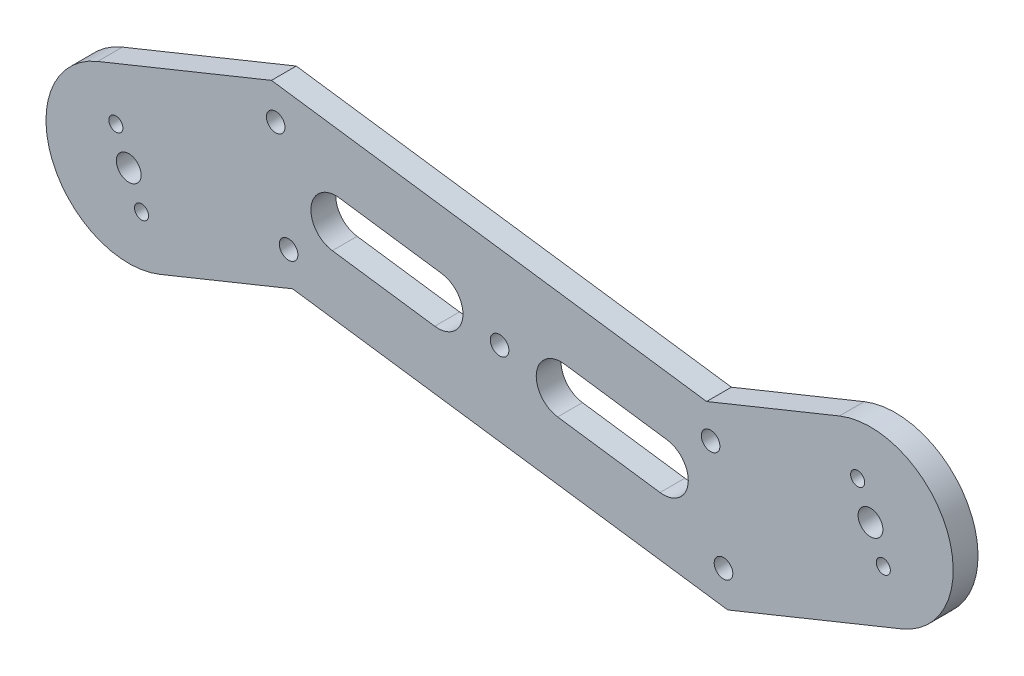
ISO-10303-21;
HEADER;
FILE_DESCRIPTION(('STEP AP214'),'2;1');
FILE_NAME('part.step','',(''),(''),'','','');
FILE_SCHEMA(('AUTOMOTIVE_DESIGN { 1 0 10303 214 1 1 1 1 }'));
ENDSEC;
DATA;
#1=APPLICATION_CONTEXT('core data for automotive mechanical design processes');
#2=APPLICATION_PROTOCOL_DEFINITION('international standard','automotive_design',2000,#1);
#3=PRODUCT_CONTEXT('',#1,'mechanical');
#4=PRODUCT('Part','Part','',(#3));
#5=PRODUCT_RELATED_PRODUCT_CATEGORY('part','',(#4));
#6=PRODUCT_DEFINITION_FORMATION('','',#4);
#7=PRODUCT_DEFINITION_CONTEXT('part definition',#1,'design');
#8=PRODUCT_DEFINITION('design','',#6,#7);
#9=PRODUCT_DEFINITION_SHAPE('','',#8);
#10=(LENGTH_UNIT() NAMED_UNIT(*) SI_UNIT(.MILLI.,.METRE.));
#11=(NAMED_UNIT(*) PLANE_ANGLE_UNIT() SI_UNIT($,.RADIAN.));
#12=(NAMED_UNIT(*) SI_UNIT($,.STERADIAN.) SOLID_ANGLE_UNIT());
#13=UNCERTAINTY_MEASURE_WITH_UNIT(LENGTH_MEASURE(1.E-05),#10,'distance_accuracy_value','');
#14=(GEOMETRIC_REPRESENTATION_CONTEXT(3) GLOBAL_UNCERTAINTY_ASSIGNED_CONTEXT((#13)) GLOBAL_UNIT_ASSIGNED_CONTEXT((#10,
#11,#12)) REPRESENTATION_CONTEXT('',''));
#15=CARTESIAN_POINT('',(0.,0.,0.));
#16=DIRECTION('',(0.,0.,1.));
#17=DIRECTION('',(1.,0.,0.));
#18=AXIS2_PLACEMENT_3D('',#15,#16,#17);
#19=CARTESIAN_POINT('',(179.33688637886,15.4363591541443,6.));
#20=DIRECTION('',(0.,0.,-1.));
#21=DIRECTION('',(-1.,0.,0.));
#22=AXIS2_PLACEMENT_3D('',#19,#20,#21);
#23=PLANE('',#22);
#24=CARTESIAN_POINT('',(182.438068149805,7.79141496706494,6.));
#25=DIRECTION('',(0.,0.,1.));
#26=DIRECTION('',(1.,0.,0.));
#27=AXIS2_PLACEMENT_3D('',#24,#25,#26);
#28=CIRCLE('',#27,1.69999999999998);
#29=CARTESIAN_POINT('',(184.138068149805,7.79141496706494,6.));
#30=VERTEX_POINT('',#29);
#31=EDGE_CURVE('E675',#30,#30,#28,.T.);
#32=ORIENTED_EDGE('',*,*,#31,.F.);
#33=EDGE_LOOP('',(#32));
#34=FACE_BOUND('',#33,.T.);
#35=CARTESIAN_POINT('',(176.235704607915,23.0813033412238,6.));
#36=DIRECTION('',(0.,0.,1.));
#37=DIRECTION('',(1.,0.,0.));
#38=AXIS2_PLACEMENT_3D('',#35,#36,#37);
#39=CIRCLE('',#38,1.69999999999998);
#40=CARTESIAN_POINT('',(177.935704607915,23.0813033412238,6.));
#41=VERTEX_POINT('',#40);
#42=EDGE_CURVE('E677',#41,#41,#39,.T.);
#43=ORIENTED_EDGE('',*,*,#42,.F.);
#44=EDGE_LOOP('',(#43));
#45=FACE_BOUND('',#44,.T.);
#46=CARTESIAN_POINT('',(-3.10118177094482,7.64494418707943,6.));
#47=DIRECTION('',(0.,0.,1.));
#48=DIRECTION('',(1.,0.,0.));
#49=AXIS2_PLACEMENT_3D('',#46,#47,#48);
#50=CIRCLE('',#49,1.69999999999999);
#51=CARTESIAN_POINT('',(-1.40118177094483,7.64494418707943,6.));
#52=VERTEX_POINT('',#51);
#53=EDGE_CURVE('E685',#52,#52,#50,.T.);
#54=ORIENTED_EDGE('',*,*,#53,.F.);
#55=EDGE_LOOP('',(#54));
#56=FACE_BOUND('',#55,.T.);
#57=CARTESIAN_POINT('',(3.10118177094482,-7.64494418707943,6.));
#58=DIRECTION('',(0.,0.,1.));
#59=DIRECTION('',(1.,0.,0.));
#60=AXIS2_PLACEMENT_3D('',#57,#58,#59);
#61=CIRCLE('',#60,1.69999999999999);
#62=CARTESIAN_POINT('',(4.80118177094481,-7.64494418707943,6.));
#63=VERTEX_POINT('',#62);
#64=EDGE_CURVE('E690',#63,#63,#61,.T.);
#65=ORIENTED_EDGE('',*,*,#64,.F.);
#66=EDGE_LOOP('',(#65));
#67=FACE_BOUND('',#66,.T.);
#68=DIRECTION('',(-0.990461425696652,0.137790290684634,0.));
#69=VECTOR('',#68,1.);
#70=CARTESIAN_POINT('',(75.6382635480882,15.7278024915215,6.));
#71=LINE('',#70,#69);
#72=CARTESIAN_POINT('',(75.6382635480882,15.7278024915215,6.));
#73=VERTEX_POINT('',#72);
#74=CARTESIAN_POINT('',(50.8767279056719,19.1725597586373,6.));
#75=VERTEX_POINT('',#74);
#76=EDGE_CURVE('E181',#73,#75,#71,.T.);
#77=ORIENTED_EDGE('',*,*,#76,.F.);
#78=CARTESIAN_POINT('',(74.8115218039804,9.78503393734157,6.));
#79=DIRECTION('',(0.,0.,1.));
#80=DIRECTION('',(1.,0.,0.));
#81=AXIS2_PLACEMENT_3D('',#78,#79,#80);
#82=CIRCLE('',#81,6.);
#83=CARTESIAN_POINT('',(73.9847800598726,3.84226538316166,6.));
#84=VERTEX_POINT('',#83);
#85=EDGE_CURVE('E53',#84,#73,#82,.T.);
#86=ORIENTED_EDGE('',*,*,#85,.F.);
#87=DIRECTION('',(0.990461425696652,-0.137790290684634,0.));
#88=VECTOR('',#87,1.);
#89=CARTESIAN_POINT('',(73.9847800598726,3.84226538316166,6.));
#90=LINE('',#89,#88);
#91=CARTESIAN_POINT('',(49.2232444174563,7.28702265027752,6.));
#92=VERTEX_POINT('',#91);
#93=EDGE_CURVE('E169',#92,#84,#90,.T.);
#94=ORIENTED_EDGE('',*,*,#93,.F.);
#95=CARTESIAN_POINT('',(50.0499861615641,13.2297912044574,6.));
#96=DIRECTION('',(0.,0.,1.));
#97=DIRECTION('',(1.,0.,0.));
#98=AXIS2_PLACEMENT_3D('',#95,#96,#97);
#99=CIRCLE('',#98,6.);
#100=EDGE_CURVE('E172',#75,#92,#99,.T.);
#101=ORIENTED_EDGE('',*,*,#100,.F.);
#102=EDGE_LOOP('',(#77,#86,#94,#101));
#103=FACE_BOUND('',#102,.T.);
#104=DIRECTION('',(-0.990461425696652,0.137790290684634,0.));
#105=VECTOR('',#104,1.);
#106=CARTESIAN_POINT('',(130.113641961404,8.14933650386659,6.));
#107=LINE('',#106,#105);
#108=CARTESIAN_POINT('',(130.113641961404,8.14933650386659,6.));
#109=VERTEX_POINT('',#108);
#110=CARTESIAN_POINT('',(105.352106318988,11.5940937709824,6.));
#111=VERTEX_POINT('',#110);
#112=EDGE_CURVE('E207',#109,#111,#107,.T.);
#113=ORIENTED_EDGE('',*,*,#112,.F.);
#114=CARTESIAN_POINT('',(129.286900217296,2.20656794968668,6.));
#115=DIRECTION('',(0.,0.,1.));
#116=DIRECTION('',(1.,0.,0.));
#117=AXIS2_PLACEMENT_3D('',#114,#115,#116);
#118=CIRCLE('',#117,6.);
#119=CARTESIAN_POINT('',(128.460158473188,-3.73620060449323,6.));
#120=VERTEX_POINT('',#119);
#121=EDGE_CURVE('E188',#120,#109,#118,.T.);
#122=ORIENTED_EDGE('',*,*,#121,.F.);
#123=DIRECTION('',(0.990461425696652,-0.137790290684634,0.));
#124=VECTOR('',#123,1.);
#125=CARTESIAN_POINT('',(128.460158473188,-3.73620060449323,6.));
#126=LINE('',#125,#124);
#127=CARTESIAN_POINT('',(103.698622830772,-0.291443337377381,6.));
#128=VERTEX_POINT('',#127);
#129=EDGE_CURVE('E196',#128,#120,#126,.T.);
#130=ORIENTED_EDGE('',*,*,#129,.F.);
#131=CARTESIAN_POINT('',(104.52536457488,5.65132521680253,6.));
#132=DIRECTION('',(0.,0.,1.));
#133=DIRECTION('',(1.,0.,0.));
#134=AXIS2_PLACEMENT_3D('',#131,#132,#133);
#135=CIRCLE('',#134,6.);
#136=EDGE_CURVE('E210',#111,#128,#135,.T.);
#137=ORIENTED_EDGE('',*,*,#136,.F.);
#138=EDGE_LOOP('',(#113,#122,#130,#137));
#139=FACE_BOUND('',#138,.T.);
#140=CARTESIAN_POINT('',(35.5351594769874,27.3646195025487,6.));
#141=DIRECTION('',(0.,0.,1.));
#142=DIRECTION('',(1.,0.,0.));
#143=AXIS2_PLACEMENT_3D('',#140,#141,#142);
#144=CIRCLE('',#143,2.24999999999999);
#145=CARTESIAN_POINT('',(37.7851594769874,27.3646195025487,6.));
#146=VERTEX_POINT('',#145);
#147=EDGE_CURVE('E217',#146,#146,#144,.T.);
#148=ORIENTED_EDGE('',*,*,#147,.F.);
#149=EDGE_LOOP('',(#148));
#150=FACE_BOUND('',#149,.T.);
#151=CARTESIAN_POINT('',(143.801726901873,-11.9282603484047,6.));
#152=DIRECTION('',(0.,0.,1.));
#153=DIRECTION('',(1.,0.,0.));
#154=AXIS2_PLACEMENT_3D('',#151,#152,#153);
#155=CIRCLE('',#154,2.25);
#156=CARTESIAN_POINT('',(146.051726901873,-11.9282603484047,6.));
#157=VERTEX_POINT('',#156);
#158=EDGE_CURVE('E226',#157,#157,#155,.T.);
#159=ORIENTED_EDGE('',*,*,#158,.F.);
#160=EDGE_LOOP('',(#159));
#161=FACE_BOUND('',#160,.T.);
#162=CARTESIAN_POINT('',(38.6541562298591,2.25235255083962,6.));
#163=DIRECTION('',(0.,0.,1.));
#164=DIRECTION('',(1.,0.,0.));
#165=AXIS2_PLACEMENT_3D('',#162,#163,#164);
#166=CIRCLE('',#165,2.24999999999999);
#167=CARTESIAN_POINT('',(40.9041562298591,2.25235255083962,6.));
#168=VERTEX_POINT('',#167);
#169=EDGE_CURVE('E230',#168,#168,#166,.T.);
#170=ORIENTED_EDGE('',*,*,#169,.F.);
#171=EDGE_LOOP('',(#170));
#172=FACE_BOUND('',#171,.T.);
#173=CARTESIAN_POINT('',(140.682730149001,13.1840066033045,6.));
#174=DIRECTION('',(0.,0.,1.));
#175=DIRECTION('',(1.,0.,0.));
#176=AXIS2_PLACEMENT_3D('',#173,#174,#175);
#177=CIRCLE('',#176,2.25);
#178=CARTESIAN_POINT('',(142.932730149001,13.1840066033045,6.));
#179=VERTEX_POINT('',#178);
#180=EDGE_CURVE('E234',#179,#179,#177,.T.);
#181=ORIENTED_EDGE('',*,*,#180,.F.);
#182=EDGE_LOOP('',(#181));
#183=FACE_BOUND('',#182,.T.);
#184=CARTESIAN_POINT('',(89.6684431894302,7.71817957707206,6.));
#185=DIRECTION('',(0.,0.,1.));
#186=DIRECTION('',(1.,0.,0.));
#187=AXIS2_PLACEMENT_3D('',#184,#185,#186);
#188=CIRCLE('',#187,2.24999999999999);
#189=CARTESIAN_POINT('',(91.9184431894302,7.71817957707206,6.));
#190=VERTEX_POINT('',#189);
#191=EDGE_CURVE('E238',#190,#190,#188,.T.);
#192=ORIENTED_EDGE('',*,*,#191,.F.);
#193=EDGE_LOOP('',(#192));
#194=FACE_BOUND('',#193,.T.);
#195=CARTESIAN_POINT('',(179.33688637886,15.4363591541443,6.));
#196=DIRECTION('',(0.,0.,1.));
#197=DIRECTION('',(1.,0.,0.));
#198=AXIS2_PLACEMENT_3D('',#195,#196,#197);
#199=CIRCLE('',#198,2.99999999999999);
#200=CARTESIAN_POINT('',(182.33688637886,15.4363591541443,6.));
#201=VERTEX_POINT('',#200);
#202=EDGE_CURVE('E250',#201,#201,#199,.T.);
#203=ORIENTED_EDGE('',*,*,#202,.F.);
#204=EDGE_LOOP('',(#203));
#205=FACE_BOUND('',#204,.T.);
#206=CARTESIAN_POINT('',(179.33688637886,15.4363591541443,6.));
#207=DIRECTION('',(0.,0.,1.));
#208=DIRECTION('',(-1.,0.,0.));
#209=AXIS2_PLACEMENT_3D('',#206,#207,#208);
#210=CIRCLE('',#209,20.);
#211=CARTESIAN_POINT('',(186.854902793272,-3.09683887513906,6.));
#212=VERTEX_POINT('',#211);
#213=CARTESIAN_POINT('',(171.818869964449,33.9695571834278,6.));
#214=VERTEX_POINT('',#213);
#215=EDGE_CURVE('E256',#212,#214,#210,.T.);
#216=ORIENTED_EDGE('',*,*,#215,.T.);
#217=DIRECTION('',(-0.926659901464171,-0.37590082072059,0.));
#218=VECTOR('',#217,1.);
#219=CARTESIAN_POINT('',(139.718429350994,20.9479707815297,6.));
#220=LINE('',#219,#218);
#221=CARTESIAN_POINT('',(139.718429350994,20.9479707815297,6.));
#222=VERTEX_POINT('',#221);
#223=EDGE_CURVE('E259',#214,#222,#220,.T.);
#224=ORIENTED_EDGE('',*,*,#223,.T.);
#225=DIRECTION('',(-0.990461425696652,0.137790290684634,0.));
#226=VECTOR('',#225,1.);
#227=CARTESIAN_POINT('',(34.5143350892678,35.5836772850323,6.));
#228=LINE('',#227,#226);
#229=CARTESIAN_POINT('',(34.5143350892678,35.5836772850323,6.));
#230=VERTEX_POINT('',#229);
#231=EDGE_CURVE('E262',#222,#230,#228,.T.);
#232=ORIENTED_EDGE('',*,*,#231,.T.);
#233=DIRECTION('',(-0.926659901464173,-0.375900820720584,0.));
#234=VECTOR('',#233,1.);
#235=CARTESIAN_POINT('',(34.5143350892678,35.5836772850323,6.));
#236=LINE('',#235,#234);
#237=CARTESIAN_POINT('',(-7.51801641441168,18.5331980292835,6.));
#238=VERTEX_POINT('',#237);
#239=EDGE_CURVE('E264',#230,#238,#236,.T.);
#240=ORIENTED_EDGE('',*,*,#239,.T.);
#241=CARTESIAN_POINT('',(0.,0.,6.));
#242=DIRECTION('',(0.,0.,1.));
#243=DIRECTION('',(1.,0.,0.));
#244=AXIS2_PLACEMENT_3D('',#241,#242,#243);
#245=CIRCLE('',#244,20.);
#246=CARTESIAN_POINT('',(7.51801641441168,-18.5331980292835,6.));
#247=VERTEX_POINT('',#246);
#248=EDGE_CURVE('E266',#238,#247,#245,.T.);
#249=ORIENTED_EDGE('',*,*,#248,.T.);
#250=DIRECTION('',(0.926659901464173,0.375900820720584,0.));
#251=VECTOR('',#250,1.);
#252=CARTESIAN_POINT('',(39.6184570278661,-5.51161162738561,6.));
#253=LINE('',#252,#251);
#254=CARTESIAN_POINT('',(39.6184570278661,-5.51161162738561,6.));
#255=VERTEX_POINT('',#254);
#256=EDGE_CURVE('E268',#247,#255,#253,.T.);
#257=ORIENTED_EDGE('',*,*,#256,.T.);
#258=DIRECTION('',(0.990461425696652,-0.137790290684634,0.));
#259=VECTOR('',#258,1.);
#260=CARTESIAN_POINT('',(39.6184570278661,-5.51161162738561,6.));
#261=LINE('',#260,#259);
#262=CARTESIAN_POINT('',(144.822551289593,-20.1473181308882,6.));
#263=VERTEX_POINT('',#262);
#264=EDGE_CURVE('E270',#255,#263,#261,.T.);
#265=ORIENTED_EDGE('',*,*,#264,.T.);
#266=DIRECTION('',(0.92665990146417,0.375900820720591,0.));
#267=VECTOR('',#266,1.);
#268=CARTESIAN_POINT('',(144.822551289593,-20.1473181308882,6.));
#269=LINE('',#268,#267);
#270=EDGE_CURVE('E273',#263,#212,#269,.T.);
#271=ORIENTED_EDGE('',*,*,#270,.T.);
#272=EDGE_LOOP('',(#216,#224,#232,#240,#249,#257,#265,#271));
#273=FACE_BOUND('',#272,.T.);
#274=CARTESIAN_POINT('',(0.,0.,6.));
#275=DIRECTION('',(0.,0.,1.));
#276=DIRECTION('',(1.,0.,0.));
#277=AXIS2_PLACEMENT_3D('',#274,#275,#276);
#278=CIRCLE('',#277,3.00000000000001);
#279=CARTESIAN_POINT('',(3.00000000000001,0.,6.));
#280=VERTEX_POINT('',#279);
#281=EDGE_CURVE('E243',#280,#280,#278,.T.);
#282=ORIENTED_EDGE('',*,*,#281,.F.);
#283=EDGE_LOOP('',(#282));
#284=FACE_BOUND('',#283,.T.);
#285=ADVANCED_FACE('F36',(#34,#45,#56,#67,#103,#139,#150,#161,#172,#183,#194,#205,#273,#284),
#23,.F.);
#286=CARTESIAN_POINT('',(179.33688637886,15.4363591541443,0.));
#287=DIRECTION('',(0.,0.,-1.));
#288=DIRECTION('',(-1.,0.,0.));
#289=AXIS2_PLACEMENT_3D('',#286,#287,#288);
#290=PLANE('',#289);
#291=CARTESIAN_POINT('',(182.438068149805,7.79141496706494,0.));
#292=DIRECTION('',(0.,0.,1.));
#293=DIRECTION('',(1.,0.,0.));
#294=AXIS2_PLACEMENT_3D('',#291,#292,#293);
#295=CIRCLE('',#294,1.69999999999998);
#296=CARTESIAN_POINT('',(184.138068149805,7.79141496706494,0.));
#297=VERTEX_POINT('',#296);
#298=EDGE_CURVE('E673',#297,#297,#295,.T.);
#299=ORIENTED_EDGE('',*,*,#298,.T.);
#300=EDGE_LOOP('',(#299));
#301=FACE_BOUND('',#300,.T.);
#302=CARTESIAN_POINT('',(176.235704607915,23.0813033412238,0.));
#303=DIRECTION('',(0.,0.,1.));
#304=DIRECTION('',(1.,0.,0.));
#305=AXIS2_PLACEMENT_3D('',#302,#303,#304);
#306=CIRCLE('',#305,1.69999999999998);
#307=CARTESIAN_POINT('',(177.935704607915,23.0813033412238,0.));
#308=VERTEX_POINT('',#307);
#309=EDGE_CURVE('E682',#308,#308,#306,.T.);
#310=ORIENTED_EDGE('',*,*,#309,.T.);
#311=EDGE_LOOP('',(#310));
#312=FACE_BOUND('',#311,.T.);
#313=CARTESIAN_POINT('',(-3.10118177094482,7.64494418707943,0.));
#314=DIRECTION('',(0.,0.,1.));
#315=DIRECTION('',(1.,0.,0.));
#316=AXIS2_PLACEMENT_3D('',#313,#314,#315);
#317=CIRCLE('',#316,1.69999999999999);
#318=CARTESIAN_POINT('',(-1.40118177094483,7.64494418707943,0.));
#319=VERTEX_POINT('',#318);
#320=EDGE_CURVE('E688',#319,#319,#317,.T.);
#321=ORIENTED_EDGE('',*,*,#320,.T.);
#322=EDGE_LOOP('',(#321));
#323=FACE_BOUND('',#322,.T.);
#324=CARTESIAN_POINT('',(3.10118177094482,-7.64494418707943,0.));
#325=DIRECTION('',(0.,0.,1.));
#326=DIRECTION('',(1.,0.,0.));
#327=AXIS2_PLACEMENT_3D('',#324,#325,#326);
#328=CIRCLE('',#327,1.69999999999999);
#329=CARTESIAN_POINT('',(4.80118177094481,-7.64494418707943,0.));
#330=VERTEX_POINT('',#329);
#331=EDGE_CURVE('E175',#330,#330,#328,.T.);
#332=ORIENTED_EDGE('',*,*,#331,.T.);
#333=EDGE_LOOP('',(#332));
#334=FACE_BOUND('',#333,.T.);
#335=CARTESIAN_POINT('',(74.8115218039804,9.78503393734157,0.));
#336=DIRECTION('',(0.,0.,1.));
#337=DIRECTION('',(1.,0.,0.));
#338=AXIS2_PLACEMENT_3D('',#335,#336,#337);
#339=CIRCLE('',#338,6.);
#340=CARTESIAN_POINT('',(73.9847800598726,3.84226538316166,0.));
#341=VERTEX_POINT('',#340);
#342=CARTESIAN_POINT('',(75.6382635480882,15.7278024915215,0.));
#343=VERTEX_POINT('',#342);
#344=EDGE_CURVE('E153',#341,#343,#339,.T.);
#345=ORIENTED_EDGE('',*,*,#344,.T.);
#346=DIRECTION('',(-0.990461425696652,0.137790290684634,0.));
#347=VECTOR('',#346,1.);
#348=CARTESIAN_POINT('',(75.6382635480882,15.7278024915215,0.));
#349=LINE('',#348,#347);
#350=CARTESIAN_POINT('',(50.8767279056719,19.1725597586373,0.));
#351=VERTEX_POINT('',#350);
#352=EDGE_CURVE('E162',#343,#351,#349,.T.);
#353=ORIENTED_EDGE('',*,*,#352,.T.);
#354=CARTESIAN_POINT('',(50.0499861615641,13.2297912044574,0.));
#355=DIRECTION('',(0.,0.,1.));
#356=DIRECTION('',(1.,0.,0.));
#357=AXIS2_PLACEMENT_3D('',#354,#355,#356);
#358=CIRCLE('',#357,6.);
#359=CARTESIAN_POINT('',(49.2232444174563,7.28702265027752,0.));
#360=VERTEX_POINT('',#359);
#361=EDGE_CURVE('E61',#351,#360,#358,.T.);
#362=ORIENTED_EDGE('',*,*,#361,.T.);
#363=DIRECTION('',(0.990461425696652,-0.137790290684634,0.));
#364=VECTOR('',#363,1.);
#365=CARTESIAN_POINT('',(73.9847800598726,3.84226538316166,0.));
#366=LINE('',#365,#364);
#367=EDGE_CURVE('E159',#360,#341,#366,.T.);
#368=ORIENTED_EDGE('',*,*,#367,.T.);
#369=EDGE_LOOP('',(#345,#353,#362,#368));
#370=FACE_BOUND('',#369,.T.);
#371=CARTESIAN_POINT('',(129.286900217296,2.20656794968668,0.));
#372=DIRECTION('',(0.,0.,1.));
#373=DIRECTION('',(1.,0.,0.));
#374=AXIS2_PLACEMENT_3D('',#371,#372,#373);
#375=CIRCLE('',#374,6.);
#376=CARTESIAN_POINT('',(128.460158473188,-3.73620060449323,0.));
#377=VERTEX_POINT('',#376);
#378=CARTESIAN_POINT('',(130.113641961404,8.14933650386659,0.));
#379=VERTEX_POINT('',#378);
#380=EDGE_CURVE('E192',#377,#379,#375,.T.);
#381=ORIENTED_EDGE('',*,*,#380,.T.);
#382=DIRECTION('',(-0.990461425696652,0.137790290684634,0.));
#383=VECTOR('',#382,1.);
#384=CARTESIAN_POINT('',(130.113641961404,8.14933650386659,0.));
#385=LINE('',#384,#383);
#386=CARTESIAN_POINT('',(105.352106318988,11.5940937709824,0.));
#387=VERTEX_POINT('',#386);
#388=EDGE_CURVE('E195',#379,#387,#385,.T.);
#389=ORIENTED_EDGE('',*,*,#388,.T.);
#390=CARTESIAN_POINT('',(104.52536457488,5.65132521680253,0.));
#391=DIRECTION('',(0.,0.,1.));
#392=DIRECTION('',(1.,0.,0.));
#393=AXIS2_PLACEMENT_3D('',#390,#391,#392);
#394=CIRCLE('',#393,6.);
#395=CARTESIAN_POINT('',(103.698622830772,-0.291443337377381,0.));
#396=VERTEX_POINT('',#395);
#397=EDGE_CURVE('E199',#387,#396,#394,.T.);
#398=ORIENTED_EDGE('',*,*,#397,.T.);
#399=DIRECTION('',(0.990461425696652,-0.137790290684634,0.));
#400=VECTOR('',#399,1.);
#401=CARTESIAN_POINT('',(128.460158473188,-3.73620060449323,0.));
#402=LINE('',#401,#400);
#403=EDGE_CURVE('E202',#396,#377,#402,.T.);
#404=ORIENTED_EDGE('',*,*,#403,.T.);
#405=EDGE_LOOP('',(#381,#389,#398,#404));
#406=FACE_BOUND('',#405,.T.);
#407=CARTESIAN_POINT('',(35.5351594769874,27.3646195025487,0.));
#408=DIRECTION('',(0.,0.,-1.));
#409=DIRECTION('',(-1.,0.,0.));
#410=AXIS2_PLACEMENT_3D('',#407,#408,#409);
#411=CIRCLE('',#410,2.24999999999999);
#412=CARTESIAN_POINT('',(33.2851594769874,27.3646195025487,0.));
#413=VERTEX_POINT('',#412);
#414=EDGE_CURVE('E40',#413,#413,#411,.T.);
#415=ORIENTED_EDGE('',*,*,#414,.F.);
#416=EDGE_LOOP('',(#415));
#417=FACE_BOUND('',#416,.T.);
#418=CARTESIAN_POINT('',(143.801726901873,-11.9282603484047,0.));
#419=DIRECTION('',(0.,0.,-1.));
#420=DIRECTION('',(-1.,0.,0.));
#421=AXIS2_PLACEMENT_3D('',#418,#419,#420);
#422=CIRCLE('',#421,2.25);
#423=CARTESIAN_POINT('',(141.551726901873,-11.9282603484047,0.));
#424=VERTEX_POINT('',#423);
#425=EDGE_CURVE('E229',#424,#424,#422,.T.);
#426=ORIENTED_EDGE('',*,*,#425,.F.);
#427=EDGE_LOOP('',(#426));
#428=FACE_BOUND('',#427,.T.);
#429=CARTESIAN_POINT('',(38.6541562298591,2.25235255083962,0.));
#430=DIRECTION('',(0.,0.,-1.));
#431=DIRECTION('',(-1.,0.,0.));
#432=AXIS2_PLACEMENT_3D('',#429,#430,#431);
#433=CIRCLE('',#432,2.24999999999999);
#434=CARTESIAN_POINT('',(36.4041562298591,2.25235255083962,0.));
#435=VERTEX_POINT('',#434);
#436=EDGE_CURVE('E233',#435,#435,#433,.T.);
#437=ORIENTED_EDGE('',*,*,#436,.F.);
#438=EDGE_LOOP('',(#437));
#439=FACE_BOUND('',#438,.T.);
#440=CARTESIAN_POINT('',(140.682730149001,13.1840066033045,0.));
#441=DIRECTION('',(0.,0.,-1.));
#442=DIRECTION('',(-1.,0.,0.));
#443=AXIS2_PLACEMENT_3D('',#440,#441,#442);
#444=CIRCLE('',#443,2.25);
#445=CARTESIAN_POINT('',(138.432730149001,13.1840066033045,0.));
#446=VERTEX_POINT('',#445);
#447=EDGE_CURVE('E237',#446,#446,#444,.T.);
#448=ORIENTED_EDGE('',*,*,#447,.F.);
#449=EDGE_LOOP('',(#448));
#450=FACE_BOUND('',#449,.T.);
#451=CARTESIAN_POINT('',(89.6684431894302,7.71817957707206,0.));
#452=DIRECTION('',(0.,0.,-1.));
#453=DIRECTION('',(-1.,0.,0.));
#454=AXIS2_PLACEMENT_3D('',#451,#452,#453);
#455=CIRCLE('',#454,2.24999999999999);
#456=CARTESIAN_POINT('',(87.4184431894302,7.71817957707206,0.));
#457=VERTEX_POINT('',#456);
#458=EDGE_CURVE('E242',#457,#457,#455,.T.);
#459=ORIENTED_EDGE('',*,*,#458,.F.);
#460=EDGE_LOOP('',(#459));
#461=FACE_BOUND('',#460,.T.);
#462=CARTESIAN_POINT('',(179.33688637886,15.4363591541443,0.));
#463=DIRECTION('',(0.,0.,1.));
#464=DIRECTION('',(1.,0.,0.));
#465=AXIS2_PLACEMENT_3D('',#462,#463,#464);
#466=CIRCLE('',#465,2.99999999999999);
#467=CARTESIAN_POINT('',(182.33688637886,15.4363591541443,0.));
#468=VERTEX_POINT('',#467);
#469=EDGE_CURVE('E246',#468,#468,#466,.T.);
#470=ORIENTED_EDGE('',*,*,#469,.T.);
#471=EDGE_LOOP('',(#470));
#472=FACE_BOUND('',#471,.T.);
#473=CARTESIAN_POINT('',(179.33688637886,15.4363591541443,0.));
#474=DIRECTION('',(0.,0.,1.));
#475=DIRECTION('',(-1.,0.,0.));
#476=AXIS2_PLACEMENT_3D('',#473,#474,#475);
#477=CIRCLE('',#476,20.);
#478=CARTESIAN_POINT('',(186.854902793272,-3.09683887513906,0.));
#479=VERTEX_POINT('',#478);
#480=CARTESIAN_POINT('',(171.818869964449,33.9695571834278,0.));
#481=VERTEX_POINT('',#480);
#482=EDGE_CURVE('E253',#479,#481,#477,.T.);
#483=ORIENTED_EDGE('',*,*,#482,.F.);
#484=DIRECTION('',(0.92665990146417,0.375900820720591,0.));
#485=VECTOR('',#484,1.);
#486=CARTESIAN_POINT('',(144.822551289593,-20.1473181308882,0.));
#487=LINE('',#486,#485);
#488=CARTESIAN_POINT('',(144.822551289593,-20.1473181308882,0.));
#489=VERTEX_POINT('',#488);
#490=EDGE_CURVE('E260',#489,#479,#487,.T.);
#491=ORIENTED_EDGE('',*,*,#490,.F.);
#492=DIRECTION('',(0.990461425696652,-0.137790290684634,0.));
#493=VECTOR('',#492,1.);
#494=CARTESIAN_POINT('',(39.6184570278661,-5.51161162738561,0.));
#495=LINE('',#494,#493);
#496=CARTESIAN_POINT('',(39.6184570278661,-5.51161162738561,0.));
#497=VERTEX_POINT('',#496);
#498=EDGE_CURVE('E289',#497,#489,#495,.T.);
#499=ORIENTED_EDGE('',*,*,#498,.F.);
#500=DIRECTION('',(0.926659901464173,0.375900820720584,0.));
#501=VECTOR('',#500,1.);
#502=CARTESIAN_POINT('',(39.6184570278661,-5.51161162738561,0.));
#503=LINE('',#502,#501);
#504=CARTESIAN_POINT('',(7.51801641441168,-18.5331980292835,0.));
#505=VERTEX_POINT('',#504);
#506=EDGE_CURVE('E287',#505,#497,#503,.T.);
#507=ORIENTED_EDGE('',*,*,#506,.F.);
#508=CARTESIAN_POINT('',(0.,0.,0.));
#509=DIRECTION('',(0.,0.,1.));
#510=DIRECTION('',(1.,0.,0.));
#511=AXIS2_PLACEMENT_3D('',#508,#509,#510);
#512=CIRCLE('',#511,20.);
#513=CARTESIAN_POINT('',(-7.51801641441168,18.5331980292835,0.));
#514=VERTEX_POINT('',#513);
#515=EDGE_CURVE('E285',#514,#505,#512,.T.);
#516=ORIENTED_EDGE('',*,*,#515,.F.);
#517=DIRECTION('',(-0.926659901464173,-0.375900820720584,0.));
#518=VECTOR('',#517,1.);
#519=CARTESIAN_POINT('',(34.5143350892678,35.5836772850323,0.));
#520=LINE('',#519,#518);
#521=CARTESIAN_POINT('',(34.5143350892678,35.5836772850323,0.));
#522=VERTEX_POINT('',#521);
#523=EDGE_CURVE('E283',#522,#514,#520,.T.);
#524=ORIENTED_EDGE('',*,*,#523,.F.);
#525=DIRECTION('',(-0.990461425696652,0.137790290684634,0.));
#526=VECTOR('',#525,1.);
#527=CARTESIAN_POINT('',(34.5143350892678,35.5836772850323,0.));
#528=LINE('',#527,#526);
#529=CARTESIAN_POINT('',(139.718429350994,20.9479707815297,0.));
#530=VERTEX_POINT('',#529);
#531=EDGE_CURVE('E280',#530,#522,#528,.T.);
#532=ORIENTED_EDGE('',*,*,#531,.F.);
#533=DIRECTION('',(-0.926659901464171,-0.37590082072059,0.));
#534=VECTOR('',#533,1.);
#535=CARTESIAN_POINT('',(139.718429350994,20.9479707815297,0.));
#536=LINE('',#535,#534);
#537=EDGE_CURVE('E278',#481,#530,#536,.T.);
#538=ORIENTED_EDGE('',*,*,#537,.F.);
#539=EDGE_LOOP('',(#483,#491,#499,#507,#516,#524,#532,#538));
#540=FACE_BOUND('',#539,.T.);
#541=CARTESIAN_POINT('',(0.,0.,0.));
#542=DIRECTION('',(0.,0.,1.));
#543=DIRECTION('',(1.,0.,0.));
#544=AXIS2_PLACEMENT_3D('',#541,#542,#543);
#545=CIRCLE('',#544,3.00000000000001);
#546=CARTESIAN_POINT('',(3.00000000000001,0.,0.));
#547=VERTEX_POINT('',#546);
#548=EDGE_CURVE('E247',#547,#547,#545,.T.);
#549=ORIENTED_EDGE('',*,*,#548,.T.);
#550=EDGE_LOOP('',(#549));
#551=FACE_BOUND('',#550,.T.);
#552=ADVANCED_FACE('F166',(#301,#312,#323,#334,#370,#406,#417,#428,#439,#450,#461,#472,#540,
#551),#290,.T.);
#553=CARTESIAN_POINT('',(179.33688637886,15.4363591541443,6.));
#554=DIRECTION('',(0.,0.,-1.));
#555=DIRECTION('',(-1.,0.,0.));
#556=AXIS2_PLACEMENT_3D('',#553,#554,#555);
#557=CYLINDRICAL_SURFACE('',#556,20.);
#558=ORIENTED_EDGE('',*,*,#482,.T.);
#559=DIRECTION('',(0.,0.,-1.));
#560=VECTOR('',#559,1.);
#561=CARTESIAN_POINT('',(171.818869964449,33.9695571834278,6.));
#562=LINE('',#561,#560);
#563=EDGE_CURVE('E11',#214,#481,#562,.T.);
#564=ORIENTED_EDGE('',*,*,#563,.F.);
#565=ORIENTED_EDGE('',*,*,#215,.F.);
#566=DIRECTION('',(0.,0.,-1.));
#567=VECTOR('',#566,1.);
#568=CARTESIAN_POINT('',(186.854902793272,-3.09683887513906,6.));
#569=LINE('',#568,#567);
#570=EDGE_CURVE('E275',#212,#479,#569,.T.);
#571=ORIENTED_EDGE('',*,*,#570,.T.);
#572=EDGE_LOOP('',(#558,#564,#565,#571));
#573=FACE_BOUND('',#572,.T.);
#574=ADVANCED_FACE('F38',(#573),#557,.T.);
#575=CARTESIAN_POINT('',(139.718429350994,20.9479707815297,6.));
#576=DIRECTION('',(0.37590082072059,-0.926659901464171,0.));
#577=DIRECTION('',(0.926659901464171,0.37590082072059,0.));
#578=AXIS2_PLACEMENT_3D('',#575,#576,#577);
#579=PLANE('',#578);
#580=ORIENTED_EDGE('',*,*,#537,.T.);
#581=DIRECTION('',(0.,0.,-1.));
#582=VECTOR('',#581,1.);
#583=CARTESIAN_POINT('',(139.718429350994,20.9479707815297,6.));
#584=LINE('',#583,#582);
#585=EDGE_CURVE('E45',#222,#530,#584,.T.);
#586=ORIENTED_EDGE('',*,*,#585,.F.);
#587=ORIENTED_EDGE('',*,*,#223,.F.);
#588=ORIENTED_EDGE('',*,*,#563,.T.);
#589=EDGE_LOOP('',(#580,#586,#587,#588));
#590=FACE_BOUND('',#589,.T.);
#591=ADVANCED_FACE('F385',(#590),#579,.F.);
#592=CARTESIAN_POINT('',(34.5143350892678,35.5836772850323,6.));
#593=DIRECTION('',(-0.137790290684634,-0.990461425696652,0.));
#594=DIRECTION('',(0.990461425696652,-0.137790290684634,0.));
#595=AXIS2_PLACEMENT_3D('',#592,#593,#594);
#596=PLANE('',#595);
#597=ORIENTED_EDGE('',*,*,#531,.T.);
#598=DIRECTION('',(0.,0.,-1.));
#599=VECTOR('',#598,1.);
#600=CARTESIAN_POINT('',(34.5143350892678,35.5836772850323,6.));
#601=LINE('',#600,#599);
#602=EDGE_CURVE('E307',#230,#522,#601,.T.);
#603=ORIENTED_EDGE('',*,*,#602,.F.);
#604=ORIENTED_EDGE('',*,*,#231,.F.);
#605=ORIENTED_EDGE('',*,*,#585,.T.);
#606=EDGE_LOOP('',(#597,#603,#604,#605));
#607=FACE_BOUND('',#606,.T.);
#608=ADVANCED_FACE('F382',(#607),#596,.F.);
#609=CARTESIAN_POINT('',(34.5143350892678,35.5836772850323,6.));
#610=DIRECTION('',(0.375900820720584,-0.926659901464173,0.));
#611=DIRECTION('',(0.926659901464173,0.375900820720584,0.));
#612=AXIS2_PLACEMENT_3D('',#609,#610,#611);
#613=PLANE('',#612);
#614=ORIENTED_EDGE('',*,*,#523,.T.);
#615=DIRECTION('',(0.,0.,-1.));
#616=VECTOR('',#615,1.);
#617=CARTESIAN_POINT('',(-7.51801641441168,18.5331980292835,6.));
#618=LINE('',#617,#616);
#619=EDGE_CURVE('E304',#238,#514,#618,.T.);
#620=ORIENTED_EDGE('',*,*,#619,.F.);
#621=ORIENTED_EDGE('',*,*,#239,.F.);
#622=ORIENTED_EDGE('',*,*,#602,.T.);
#623=EDGE_LOOP('',(#614,#620,#621,#622));
#624=FACE_BOUND('',#623,.T.);
#625=ADVANCED_FACE('F378',(#624),#613,.F.);
#626=CARTESIAN_POINT('',(0.,0.,6.));
#627=DIRECTION('',(0.,0.,-1.));
#628=DIRECTION('',(-1.,0.,0.));
#629=AXIS2_PLACEMENT_3D('',#626,#627,#628);
#630=CYLINDRICAL_SURFACE('',#629,20.);
#631=ORIENTED_EDGE('',*,*,#515,.T.);
#632=DIRECTION('',(0.,0.,-1.));
#633=VECTOR('',#632,1.);
#634=CARTESIAN_POINT('',(7.51801641441168,-18.5331980292835,6.));
#635=LINE('',#634,#633);
#636=EDGE_CURVE('E301',#247,#505,#635,.T.);
#637=ORIENTED_EDGE('',*,*,#636,.F.);
#638=ORIENTED_EDGE('',*,*,#248,.F.);
#639=ORIENTED_EDGE('',*,*,#619,.T.);
#640=EDGE_LOOP('',(#631,#637,#638,#639));
#641=FACE_BOUND('',#640,.T.);
#642=ADVANCED_FACE('F374',(#641),#630,.T.);
#643=CARTESIAN_POINT('',(39.6184570278661,-5.51161162738561,6.));
#644=DIRECTION('',(-0.375900820720584,0.926659901464173,0.));
#645=DIRECTION('',(-0.926659901464173,-0.375900820720584,0.));
#646=AXIS2_PLACEMENT_3D('',#643,#644,#645);
#647=PLANE('',#646);
#648=ORIENTED_EDGE('',*,*,#506,.T.);
#649=DIRECTION('',(0.,0.,-1.));
#650=VECTOR('',#649,1.);
#651=CARTESIAN_POINT('',(39.6184570278661,-5.51161162738561,6.));
#652=LINE('',#651,#650);
#653=EDGE_CURVE('E298',#255,#497,#652,.T.);
#654=ORIENTED_EDGE('',*,*,#653,.F.);
#655=ORIENTED_EDGE('',*,*,#256,.F.);
#656=ORIENTED_EDGE('',*,*,#636,.T.);
#657=EDGE_LOOP('',(#648,#654,#655,#656));
#658=FACE_BOUND('',#657,.T.);
#659=ADVANCED_FACE('F370',(#658),#647,.F.);
#660=CARTESIAN_POINT('',(39.6184570278661,-5.51161162738561,6.));
#661=DIRECTION('',(0.137790290684634,0.990461425696652,0.));
#662=DIRECTION('',(-0.990461425696652,0.137790290684634,0.));
#663=AXIS2_PLACEMENT_3D('',#660,#661,#662);
#664=PLANE('',#663);
#665=ORIENTED_EDGE('',*,*,#498,.T.);
#666=DIRECTION('',(0.,0.,-1.));
#667=VECTOR('',#666,1.);
#668=CARTESIAN_POINT('',(144.822551289593,-20.1473181308882,6.));
#669=LINE('',#668,#667);
#670=EDGE_CURVE('E295',#263,#489,#669,.T.);
#671=ORIENTED_EDGE('',*,*,#670,.F.);
#672=ORIENTED_EDGE('',*,*,#264,.F.);
#673=ORIENTED_EDGE('',*,*,#653,.T.);
#674=EDGE_LOOP('',(#665,#671,#672,#673));
#675=FACE_BOUND('',#674,.T.);
#676=ADVANCED_FACE('F366',(#675),#664,.F.);
#677=CARTESIAN_POINT('',(144.822551289593,-20.1473181308882,6.));
#678=DIRECTION('',(-0.375900820720591,0.92665990146417,0.));
#679=DIRECTION('',(-0.926659901464171,-0.375900820720591,0.));
#680=AXIS2_PLACEMENT_3D('',#677,#678,#679);
#681=PLANE('',#680);
#682=ORIENTED_EDGE('',*,*,#490,.T.);
#683=ORIENTED_EDGE('',*,*,#570,.F.);
#684=ORIENTED_EDGE('',*,*,#270,.F.);
#685=ORIENTED_EDGE('',*,*,#670,.T.);
#686=EDGE_LOOP('',(#682,#683,#684,#685));
#687=FACE_BOUND('',#686,.T.);
#688=ADVANCED_FACE('F353',(#687),#681,.F.);
#689=CARTESIAN_POINT('',(179.33688637886,15.4363591541443,6.));
#690=DIRECTION('',(0.,0.,-1.));
#691=DIRECTION('',(-1.,0.,0.));
#692=AXIS2_PLACEMENT_3D('',#689,#690,#691);
#693=CYLINDRICAL_SURFACE('',#692,2.99999999999999);
#694=ORIENTED_EDGE('',*,*,#202,.T.);
#695=EDGE_LOOP('',(#694));
#696=FACE_BOUND('',#695,.T.);
#697=ORIENTED_EDGE('',*,*,#469,.F.);
#698=EDGE_LOOP('',(#697));
#699=FACE_BOUND('',#698,.T.);
#700=ADVANCED_FACE('F343',(#696,#699),#693,.F.);
#701=CARTESIAN_POINT('',(0.,0.,6.));
#702=DIRECTION('',(0.,0.,-1.));
#703=DIRECTION('',(-1.,0.,0.));
#704=AXIS2_PLACEMENT_3D('',#701,#702,#703);
#705=CYLINDRICAL_SURFACE('',#704,3.00000000000001);
#706=ORIENTED_EDGE('',*,*,#281,.T.);
#707=EDGE_LOOP('',(#706));
#708=FACE_BOUND('',#707,.T.);
#709=ORIENTED_EDGE('',*,*,#548,.F.);
#710=EDGE_LOOP('',(#709));
#711=FACE_BOUND('',#710,.T.);
#712=ADVANCED_FACE('F340',(#708,#711),#705,.F.);
#713=CARTESIAN_POINT('',(89.6684431894302,7.71817957707206,6.));
#714=DIRECTION('',(0.,0.,1.));
#715=DIRECTION('',(1.,0.,0.));
#716=AXIS2_PLACEMENT_3D('',#713,#714,#715);
#717=CYLINDRICAL_SURFACE('',#716,2.24999999999999);
#718=ORIENTED_EDGE('',*,*,#458,.T.);
#719=EDGE_LOOP('',(#718));
#720=FACE_BOUND('',#719,.T.);
#721=ORIENTED_EDGE('',*,*,#191,.T.);
#722=EDGE_LOOP('',(#721));
#723=FACE_BOUND('',#722,.T.);
#724=ADVANCED_FACE('F342',(#720,#723),#717,.F.);
#725=CARTESIAN_POINT('',(140.682730149001,13.1840066033045,6.));
#726=DIRECTION('',(0.,0.,1.));
#727=DIRECTION('',(1.,0.,0.));
#728=AXIS2_PLACEMENT_3D('',#725,#726,#727);
#729=CYLINDRICAL_SURFACE('',#728,2.25);
#730=ORIENTED_EDGE('',*,*,#447,.T.);
#731=EDGE_LOOP('',(#730));
#732=FACE_BOUND('',#731,.T.);
#733=ORIENTED_EDGE('',*,*,#180,.T.);
#734=EDGE_LOOP('',(#733));
#735=FACE_BOUND('',#734,.T.);
#736=ADVANCED_FACE('F350',(#732,#735),#729,.F.);
#737=CARTESIAN_POINT('',(38.6541562298591,2.25235255083962,6.));
#738=DIRECTION('',(0.,0.,1.));
#739=DIRECTION('',(1.,0.,0.));
#740=AXIS2_PLACEMENT_3D('',#737,#738,#739);
#741=CYLINDRICAL_SURFACE('',#740,2.24999999999999);
#742=ORIENTED_EDGE('',*,*,#436,.T.);
#743=EDGE_LOOP('',(#742));
#744=FACE_BOUND('',#743,.T.);
#745=ORIENTED_EDGE('',*,*,#169,.T.);
#746=EDGE_LOOP('',(#745));
#747=FACE_BOUND('',#746,.T.);
#748=ADVANCED_FACE('F506',(#744,#747),#741,.F.);
#749=CARTESIAN_POINT('',(143.801726901873,-11.9282603484047,6.));
#750=DIRECTION('',(0.,0.,1.));
#751=DIRECTION('',(1.,0.,0.));
#752=AXIS2_PLACEMENT_3D('',#749,#750,#751);
#753=CYLINDRICAL_SURFACE('',#752,2.25);
#754=ORIENTED_EDGE('',*,*,#425,.T.);
#755=EDGE_LOOP('',(#754));
#756=FACE_BOUND('',#755,.T.);
#757=ORIENTED_EDGE('',*,*,#158,.T.);
#758=EDGE_LOOP('',(#757));
#759=FACE_BOUND('',#758,.T.);
#760=ADVANCED_FACE('F320',(#756,#759),#753,.F.);
#761=CARTESIAN_POINT('',(35.5351594769874,27.3646195025487,6.));
#762=DIRECTION('',(0.,0.,1.));
#763=DIRECTION('',(1.,0.,0.));
#764=AXIS2_PLACEMENT_3D('',#761,#762,#763);
#765=CYLINDRICAL_SURFACE('',#764,2.24999999999999);
#766=ORIENTED_EDGE('',*,*,#414,.T.);
#767=EDGE_LOOP('',(#766));
#768=FACE_BOUND('',#767,.T.);
#769=ORIENTED_EDGE('',*,*,#147,.T.);
#770=EDGE_LOOP('',(#769));
#771=FACE_BOUND('',#770,.T.);
#772=ADVANCED_FACE('F499',(#768,#771),#765,.F.);
#773=CARTESIAN_POINT('',(129.286900217296,2.20656794968668,0.));
#774=DIRECTION('',(0.,0.,1.));
#775=DIRECTION('',(1.,0.,0.));
#776=AXIS2_PLACEMENT_3D('',#773,#774,#775);
#777=CYLINDRICAL_SURFACE('',#776,6.);
#778=ORIENTED_EDGE('',*,*,#121,.T.);
#779=DIRECTION('',(0.,0.,1.));
#780=VECTOR('',#779,1.);
#781=CARTESIAN_POINT('',(130.113641961404,8.14933650386659,0.));
#782=LINE('',#781,#780);
#783=EDGE_CURVE('E205',#379,#109,#782,.T.);
#784=ORIENTED_EDGE('',*,*,#783,.F.);
#785=ORIENTED_EDGE('',*,*,#380,.F.);
#786=DIRECTION('',(0.,0.,1.));
#787=VECTOR('',#786,1.);
#788=CARTESIAN_POINT('',(128.460158473188,-3.73620060449323,0.));
#789=LINE('',#788,#787);
#790=EDGE_CURVE('E215',#377,#120,#789,.T.);
#791=ORIENTED_EDGE('',*,*,#790,.T.);
#792=EDGE_LOOP('',(#778,#784,#785,#791));
#793=FACE_BOUND('',#792,.T.);
#794=ADVANCED_FACE('F489',(#793),#777,.F.);
#795=CARTESIAN_POINT('',(128.460158473188,-3.73620060449323,0.));
#796=DIRECTION('',(-0.137790290684634,-0.990461425696652,0.));
#797=DIRECTION('',(0.990461425696652,-0.137790290684634,0.));
#798=AXIS2_PLACEMENT_3D('',#795,#796,#797);
#799=PLANE('',#798);
#800=ORIENTED_EDGE('',*,*,#129,.T.);
#801=ORIENTED_EDGE('',*,*,#790,.F.);
#802=ORIENTED_EDGE('',*,*,#403,.F.);
#803=DIRECTION('',(0.,0.,1.));
#804=VECTOR('',#803,1.);
#805=CARTESIAN_POINT('',(103.698622830772,-0.291443337377381,0.));
#806=LINE('',#805,#804);
#807=EDGE_CURVE('E218',#396,#128,#806,.T.);
#808=ORIENTED_EDGE('',*,*,#807,.T.);
#809=EDGE_LOOP('',(#800,#801,#802,#808));
#810=FACE_BOUND('',#809,.T.);
#811=ADVANCED_FACE('F485',(#810),#799,.F.);
#812=CARTESIAN_POINT('',(104.52536457488,5.65132521680253,0.));
#813=DIRECTION('',(0.,0.,1.));
#814=DIRECTION('',(1.,0.,0.));
#815=AXIS2_PLACEMENT_3D('',#812,#813,#814);
#816=CYLINDRICAL_SURFACE('',#815,6.);
#817=ORIENTED_EDGE('',*,*,#136,.T.);
#818=ORIENTED_EDGE('',*,*,#807,.F.);
#819=ORIENTED_EDGE('',*,*,#397,.F.);
#820=DIRECTION('',(0.,0.,1.));
#821=VECTOR('',#820,1.);
#822=CARTESIAN_POINT('',(105.352106318988,11.5940937709824,0.));
#823=LINE('',#822,#821);
#824=EDGE_CURVE('E220',#387,#111,#823,.T.);
#825=ORIENTED_EDGE('',*,*,#824,.T.);
#826=EDGE_LOOP('',(#817,#818,#819,#825));
#827=FACE_BOUND('',#826,.T.);
#828=ADVANCED_FACE('F488',(#827),#816,.F.);
#829=CARTESIAN_POINT('',(130.113641961404,8.14933650386659,0.));
#830=DIRECTION('',(0.137790290684634,0.990461425696652,0.));
#831=DIRECTION('',(-0.990461425696652,0.137790290684634,0.));
#832=AXIS2_PLACEMENT_3D('',#829,#830,#831);
#833=PLANE('',#832);
#834=ORIENTED_EDGE('',*,*,#112,.T.);
#835=ORIENTED_EDGE('',*,*,#824,.F.);
#836=ORIENTED_EDGE('',*,*,#388,.F.);
#837=ORIENTED_EDGE('',*,*,#783,.T.);
#838=EDGE_LOOP('',(#834,#835,#836,#837));
#839=FACE_BOUND('',#838,.T.);
#840=ADVANCED_FACE('F484',(#839),#833,.F.);
#841=CARTESIAN_POINT('',(74.8115218039804,9.78503393734157,0.));
#842=DIRECTION('',(0.,0.,1.));
#843=DIRECTION('',(1.,0.,0.));
#844=AXIS2_PLACEMENT_3D('',#841,#842,#843);
#845=CYLINDRICAL_SURFACE('',#844,6.);
#846=ORIENTED_EDGE('',*,*,#85,.T.);
#847=DIRECTION('',(0.,0.,1.));
#848=VECTOR('',#847,1.);
#849=CARTESIAN_POINT('',(75.6382635480882,15.7278024915215,0.));
#850=LINE('',#849,#848);
#851=EDGE_CURVE('E149',#343,#73,#850,.T.);
#852=ORIENTED_EDGE('',*,*,#851,.F.);
#853=ORIENTED_EDGE('',*,*,#344,.F.);
#854=DIRECTION('',(0.,0.,1.));
#855=VECTOR('',#854,1.);
#856=CARTESIAN_POINT('',(73.9847800598726,3.84226538316166,0.));
#857=LINE('',#856,#855);
#858=EDGE_CURVE('E186',#341,#84,#857,.T.);
#859=ORIENTED_EDGE('',*,*,#858,.T.);
#860=EDGE_LOOP('',(#846,#852,#853,#859));
#861=FACE_BOUND('',#860,.T.);
#862=ADVANCED_FACE('F151',(#861),#845,.F.);
#863=CARTESIAN_POINT('',(73.9847800598726,3.84226538316166,0.));
#864=DIRECTION('',(-0.137790290684634,-0.990461425696652,0.));
#865=DIRECTION('',(0.990461425696652,-0.137790290684634,0.));
#866=AXIS2_PLACEMENT_3D('',#863,#864,#865);
#867=PLANE('',#866);
#868=ORIENTED_EDGE('',*,*,#93,.T.);
#869=ORIENTED_EDGE('',*,*,#858,.F.);
#870=ORIENTED_EDGE('',*,*,#367,.F.);
#871=DIRECTION('',(0.,0.,1.));
#872=VECTOR('',#871,1.);
#873=CARTESIAN_POINT('',(49.2232444174563,7.28702265027752,0.));
#874=LINE('',#873,#872);
#875=EDGE_CURVE('E189',#360,#92,#874,.T.);
#876=ORIENTED_EDGE('',*,*,#875,.T.);
#877=EDGE_LOOP('',(#868,#869,#870,#876));
#878=FACE_BOUND('',#877,.T.);
#879=ADVANCED_FACE('F474',(#878),#867,.F.);
#880=CARTESIAN_POINT('',(50.0499861615641,13.2297912044574,0.));
#881=DIRECTION('',(0.,0.,1.));
#882=DIRECTION('',(1.,0.,0.));
#883=AXIS2_PLACEMENT_3D('',#880,#881,#882);
#884=CYLINDRICAL_SURFACE('',#883,6.);
#885=ORIENTED_EDGE('',*,*,#100,.T.);
#886=ORIENTED_EDGE('',*,*,#875,.F.);
#887=ORIENTED_EDGE('',*,*,#361,.F.);
#888=DIRECTION('',(0.,0.,1.));
#889=VECTOR('',#888,1.);
#890=CARTESIAN_POINT('',(50.8767279056719,19.1725597586373,0.));
#891=LINE('',#890,#889);
#892=EDGE_CURVE('E158',#351,#75,#891,.T.);
#893=ORIENTED_EDGE('',*,*,#892,.T.);
#894=EDGE_LOOP('',(#885,#886,#887,#893));
#895=FACE_BOUND('',#894,.T.);
#896=ADVANCED_FACE('F477',(#895),#884,.F.);
#897=CARTESIAN_POINT('',(75.6382635480882,15.7278024915215,0.));
#898=DIRECTION('',(0.137790290684634,0.990461425696652,0.));
#899=DIRECTION('',(-0.990461425696652,0.137790290684634,0.));
#900=AXIS2_PLACEMENT_3D('',#897,#898,#899);
#901=PLANE('',#900);
#902=ORIENTED_EDGE('',*,*,#76,.T.);
#903=ORIENTED_EDGE('',*,*,#892,.F.);
#904=ORIENTED_EDGE('',*,*,#352,.F.);
#905=ORIENTED_EDGE('',*,*,#851,.T.);
#906=EDGE_LOOP('',(#902,#903,#904,#905));
#907=FACE_BOUND('',#906,.T.);
#908=ADVANCED_FACE('F163',(#907),#901,.F.);
#909=CARTESIAN_POINT('',(3.10118177094482,-7.64494418707943,6.));
#910=DIRECTION('',(0.,0.,1.));
#911=DIRECTION('',(1.,0.,0.));
#912=AXIS2_PLACEMENT_3D('',#909,#910,#911);
#913=CYLINDRICAL_SURFACE('',#912,1.69999999999999);
#914=ORIENTED_EDGE('',*,*,#331,.F.);
#915=EDGE_LOOP('',(#914));
#916=FACE_BOUND('',#915,.T.);
#917=ORIENTED_EDGE('',*,*,#64,.T.);
#918=EDGE_LOOP('',(#917));
#919=FACE_BOUND('',#918,.T.);
#920=ADVANCED_FACE('F430',(#916,#919),#913,.F.);
#921=CARTESIAN_POINT('',(-3.10118177094482,7.64494418707943,6.));
#922=DIRECTION('',(0.,0.,1.));
#923=DIRECTION('',(1.,0.,0.));
#924=AXIS2_PLACEMENT_3D('',#921,#922,#923);
#925=CYLINDRICAL_SURFACE('',#924,1.69999999999999);
#926=ORIENTED_EDGE('',*,*,#320,.F.);
#927=EDGE_LOOP('',(#926));
#928=FACE_BOUND('',#927,.T.);
#929=ORIENTED_EDGE('',*,*,#53,.T.);
#930=EDGE_LOOP('',(#929));
#931=FACE_BOUND('',#930,.T.);
#932=ADVANCED_FACE('F435',(#928,#931),#925,.F.);
#933=CARTESIAN_POINT('',(176.235704607915,23.0813033412238,6.));
#934=DIRECTION('',(0.,0.,1.));
#935=DIRECTION('',(1.,0.,0.));
#936=AXIS2_PLACEMENT_3D('',#933,#934,#935);
#937=CYLINDRICAL_SURFACE('',#936,1.69999999999998);
#938=ORIENTED_EDGE('',*,*,#309,.F.);
#939=EDGE_LOOP('',(#938));
#940=FACE_BOUND('',#939,.T.);
#941=ORIENTED_EDGE('',*,*,#42,.T.);
#942=EDGE_LOOP('',(#941));
#943=FACE_BOUND('',#942,.T.);
#944=ADVANCED_FACE('F447',(#940,#943),#937,.F.);
#945=CARTESIAN_POINT('',(182.438068149805,7.79141496706494,6.));
#946=DIRECTION('',(0.,0.,1.));
#947=DIRECTION('',(1.,0.,0.));
#948=AXIS2_PLACEMENT_3D('',#945,#946,#947);
#949=CYLINDRICAL_SURFACE('',#948,1.69999999999998);
#950=ORIENTED_EDGE('',*,*,#298,.F.);
#951=EDGE_LOOP('',(#950));
#952=FACE_BOUND('',#951,.T.);
#953=ORIENTED_EDGE('',*,*,#31,.T.);
#954=EDGE_LOOP('',(#953));
#955=FACE_BOUND('',#954,.T.);
#956=ADVANCED_FACE('F457',(#952,#955),#949,.F.);
#957=CLOSED_SHELL('',(#285,#552,#574,#591,#608,#625,#642,#659,#676,#688,#700,#712,#724,#736,
#748,#760,#772,#794,#811,#828,#840,#862,#879,#896,#908,#920,#932,#944,#956));
#958=MANIFOLD_SOLID_BREP('B2',#957);
#959=ADVANCED_BREP_SHAPE_REPRESENTATION('',(#18,#958),#14);
#960=SHAPE_DEFINITION_REPRESENTATION(#9,#959);
ENDSEC;
END-ISO-10303-21;
